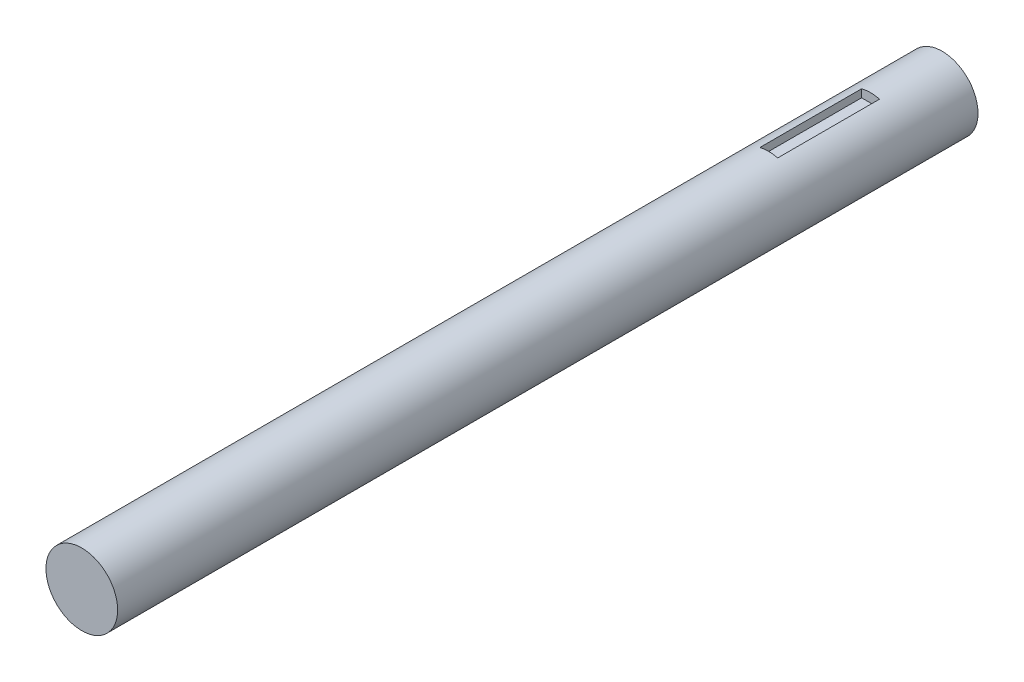
ISO-10303-21;
HEADER;
FILE_DESCRIPTION(('STEP AP214'),'2;1');
FILE_NAME('part.step','',(''),(''),'','','');
FILE_SCHEMA(('AUTOMOTIVE_DESIGN { 1 0 10303 214 1 1 1 1 }'));
ENDSEC;
DATA;
#1=APPLICATION_CONTEXT('core data for automotive mechanical design processes');
#2=APPLICATION_PROTOCOL_DEFINITION('international standard','automotive_design',2000,#1);
#3=PRODUCT_CONTEXT('',#1,'mechanical');
#4=PRODUCT('Part','Part','',(#3));
#5=PRODUCT_RELATED_PRODUCT_CATEGORY('part','',(#4));
#6=PRODUCT_DEFINITION_FORMATION('','',#4);
#7=PRODUCT_DEFINITION_CONTEXT('part definition',#1,'design');
#8=PRODUCT_DEFINITION('design','',#6,#7);
#9=PRODUCT_DEFINITION_SHAPE('','',#8);
#10=(LENGTH_UNIT() NAMED_UNIT(*) SI_UNIT(.MILLI.,.METRE.));
#11=(NAMED_UNIT(*) PLANE_ANGLE_UNIT() SI_UNIT($,.RADIAN.));
#12=(NAMED_UNIT(*) SI_UNIT($,.STERADIAN.) SOLID_ANGLE_UNIT());
#13=UNCERTAINTY_MEASURE_WITH_UNIT(LENGTH_MEASURE(1.E-05),#10,'distance_accuracy_value','');
#14=(GEOMETRIC_REPRESENTATION_CONTEXT(3) GLOBAL_UNCERTAINTY_ASSIGNED_CONTEXT((#13)) GLOBAL_UNIT_ASSIGNED_CONTEXT((#10,
#11,#12)) REPRESENTATION_CONTEXT('',''));
#15=CARTESIAN_POINT('',(0.,0.,0.));
#16=DIRECTION('',(0.,0.,1.));
#17=DIRECTION('',(1.,0.,0.));
#18=AXIS2_PLACEMENT_3D('',#15,#16,#17);
#19=CARTESIAN_POINT('',(0.,0.,152.4));
#20=DIRECTION('',(0.,0.,-1.));
#21=DIRECTION('',(-1.,0.,0.));
#22=AXIS2_PLACEMENT_3D('',#19,#20,#21);
#23=CYLINDRICAL_SURFACE('',#22,6.35);
#24=CARTESIAN_POINT('',(0.,0.,0.));
#25=DIRECTION('',(0.,0.,1.));
#26=DIRECTION('',(1.,0.,0.));
#27=AXIS2_PLACEMENT_3D('',#24,#25,#26);
#28=CIRCLE('',#27,6.35);
#29=CARTESIAN_POINT('',(6.35,0.,0.));
#30=VERTEX_POINT('',#29);
#31=EDGE_CURVE('E99',#30,#30,#28,.T.);
#32=ORIENTED_EDGE('',*,*,#31,.T.);
#33=EDGE_LOOP('',(#32));
#34=FACE_BOUND('',#33,.T.);
#35=CARTESIAN_POINT('',(0.,0.,152.4));
#36=DIRECTION('',(0.,0.,1.));
#37=DIRECTION('',(1.,0.,0.));
#38=AXIS2_PLACEMENT_3D('',#35,#36,#37);
#39=CIRCLE('',#38,6.35);
#40=CARTESIAN_POINT('',(6.35,0.,152.4));
#41=VERTEX_POINT('',#40);
#42=EDGE_CURVE('E101',#41,#41,#39,.T.);
#43=ORIENTED_EDGE('',*,*,#42,.F.);
#44=EDGE_LOOP('',(#43));
#45=FACE_BOUND('',#44,.T.);
#46=CARTESIAN_POINT('',(0.,0.,30.734));
#47=DIRECTION('',(0.,0.,-1.));
#48=DIRECTION('',(-1.,0.,0.));
#49=AXIS2_PLACEMENT_3D('',#46,#47,#48);
#50=CIRCLE('',#49,6.35);
#51=CARTESIAN_POINT('',(-1.57143332462789,6.15248708298107,30.734));
#52=VERTEX_POINT('',#51);
#53=CARTESIAN_POINT('',(1.60356667537211,6.1441902572785,30.734));
#54=VERTEX_POINT('',#53);
#55=EDGE_CURVE('E11',#52,#54,#50,.T.);
#56=ORIENTED_EDGE('',*,*,#55,.F.);
#57=DIRECTION('',(0.,0.,-1.));
#58=VECTOR('',#57,1.);
#59=CARTESIAN_POINT('',(-1.57143332462789,6.15248708298107,152.4));
#60=LINE('',#59,#58);
#61=CARTESIAN_POINT('',(-1.57143332462789,6.15248708298107,12.7));
#62=VERTEX_POINT('',#61);
#63=EDGE_CURVE('E55',#52,#62,#60,.T.);
#64=ORIENTED_EDGE('',*,*,#63,.T.);
#65=CARTESIAN_POINT('',(0.,0.,12.7));
#66=DIRECTION('',(0.,0.,-1.));
#67=DIRECTION('',(-1.,0.,0.));
#68=AXIS2_PLACEMENT_3D('',#65,#66,#67);
#69=CIRCLE('',#68,6.35);
#70=CARTESIAN_POINT('',(1.60356667537211,6.1441902572785,12.7));
#71=VERTEX_POINT('',#70);
#72=EDGE_CURVE('E104',#62,#71,#69,.T.);
#73=ORIENTED_EDGE('',*,*,#72,.T.);
#74=DIRECTION('',(0.,0.,-1.));
#75=VECTOR('',#74,1.);
#76=CARTESIAN_POINT('',(1.60356667537211,6.1441902572785,152.4));
#77=LINE('',#76,#75);
#78=EDGE_CURVE('E40',#71,#54,#77,.F.);
#79=ORIENTED_EDGE('',*,*,#78,.T.);
#80=EDGE_LOOP('',(#56,#64,#73,#79));
#81=FACE_BOUND('',#80,.T.);
#82=ADVANCED_FACE('F33',(#34,#45,#81),#23,.T.);
#83=CARTESIAN_POINT('',(0.,0.,152.4));
#84=DIRECTION('',(0.,0.,1.));
#85=DIRECTION('',(1.,0.,0.));
#86=AXIS2_PLACEMENT_3D('',#83,#84,#85);
#87=PLANE('',#86);
#88=ORIENTED_EDGE('',*,*,#42,.T.);
#89=EDGE_LOOP('',(#88));
#90=FACE_BOUND('',#89,.T.);
#91=ADVANCED_FACE('F124',(#90),#87,.T.);
#92=CARTESIAN_POINT('',(0.,0.,0.));
#93=DIRECTION('',(0.,0.,1.));
#94=DIRECTION('',(1.,0.,0.));
#95=AXIS2_PLACEMENT_3D('',#92,#93,#94);
#96=PLANE('',#95);
#97=ORIENTED_EDGE('',*,*,#31,.F.);
#98=EDGE_LOOP('',(#97));
#99=FACE_BOUND('',#98,.T.);
#100=ADVANCED_FACE('F129',(#99),#96,.F.);
#101=CARTESIAN_POINT('',(1.60356667537211,7.9375,30.734));
#102=DIRECTION('',(1.,0.,0.));
#103=DIRECTION('',(0.,1.,0.));
#104=AXIS2_PLACEMENT_3D('',#101,#102,#103);
#105=PLANE('',#104);
#106=DIRECTION('',(0.,-1.,0.));
#107=VECTOR('',#106,1.);
#108=CARTESIAN_POINT('',(1.60356667537211,7.9375,12.7));
#109=LINE('',#108,#107);
#110=CARTESIAN_POINT('',(1.60356667537211,4.7625,12.7));
#111=VERTEX_POINT('',#110);
#112=EDGE_CURVE('E47',#71,#111,#109,.T.);
#113=ORIENTED_EDGE('',*,*,#112,.T.);
#114=DIRECTION('',(0.,0.,-1.));
#115=VECTOR('',#114,1.);
#116=CARTESIAN_POINT('',(1.60356667537211,4.7625,30.734));
#117=LINE('',#116,#115);
#118=CARTESIAN_POINT('',(1.60356667537211,4.7625,30.734));
#119=VERTEX_POINT('',#118);
#120=EDGE_CURVE('E89',#119,#111,#117,.T.);
#121=ORIENTED_EDGE('',*,*,#120,.F.);
#122=DIRECTION('',(0.,-1.,0.));
#123=VECTOR('',#122,1.);
#124=CARTESIAN_POINT('',(1.60356667537211,7.9375,30.734));
#125=LINE('',#124,#123);
#126=EDGE_CURVE('E79',#54,#119,#125,.T.);
#127=ORIENTED_EDGE('',*,*,#126,.F.);
#128=ORIENTED_EDGE('',*,*,#78,.F.);
#129=EDGE_LOOP('',(#113,#121,#127,#128));
#130=FACE_BOUND('',#129,.T.);
#131=ADVANCED_FACE('F112',(#130),#105,.F.);
#132=CARTESIAN_POINT('',(-1.57143332462789,4.7625,30.734));
#133=DIRECTION('',(-1.,0.,0.));
#134=DIRECTION('',(0.,0.,1.));
#135=AXIS2_PLACEMENT_3D('',#132,#133,#134);
#136=PLANE('',#135);
#137=DIRECTION('',(0.,1.,0.));
#138=VECTOR('',#137,1.);
#139=CARTESIAN_POINT('',(-1.57143332462789,4.7625,30.734));
#140=LINE('',#139,#138);
#141=CARTESIAN_POINT('',(-1.57143332462789,4.7625,30.734));
#142=VERTEX_POINT('',#141);
#143=EDGE_CURVE('E76',#142,#52,#140,.T.);
#144=ORIENTED_EDGE('',*,*,#143,.F.);
#145=DIRECTION('',(0.,0.,-1.));
#146=VECTOR('',#145,1.);
#147=CARTESIAN_POINT('',(-1.57143332462789,4.7625,30.734));
#148=LINE('',#147,#146);
#149=CARTESIAN_POINT('',(-1.57143332462789,4.7625,12.7));
#150=VERTEX_POINT('',#149);
#151=EDGE_CURVE('E85',#142,#150,#148,.T.);
#152=ORIENTED_EDGE('',*,*,#151,.T.);
#153=DIRECTION('',(0.,1.,0.));
#154=VECTOR('',#153,1.);
#155=CARTESIAN_POINT('',(-1.57143332462789,4.7625,12.7));
#156=LINE('',#155,#154);
#157=EDGE_CURVE('E96',#150,#62,#156,.T.);
#158=ORIENTED_EDGE('',*,*,#157,.T.);
#159=ORIENTED_EDGE('',*,*,#63,.F.);
#160=EDGE_LOOP('',(#144,#152,#158,#159));
#161=FACE_BOUND('',#160,.T.);
#162=ADVANCED_FACE('F91',(#161),#136,.F.);
#163=CARTESIAN_POINT('',(0.,0.,30.734));
#164=DIRECTION('',(0.,0.,-1.));
#165=DIRECTION('',(-1.,0.,0.));
#166=AXIS2_PLACEMENT_3D('',#163,#164,#165);
#167=PLANE('',#166);
#168=ORIENTED_EDGE('',*,*,#55,.T.);
#169=ORIENTED_EDGE('',*,*,#126,.T.);
#170=DIRECTION('',(-1.,0.,0.));
#171=VECTOR('',#170,1.);
#172=CARTESIAN_POINT('',(0.0160666753721095,4.7625,30.734));
#173=LINE('',#172,#171);
#174=EDGE_CURVE('E73',#119,#142,#173,.T.);
#175=ORIENTED_EDGE('',*,*,#174,.T.);
#176=ORIENTED_EDGE('',*,*,#143,.T.);
#177=EDGE_LOOP('',(#168,#169,#175,#176));
#178=FACE_BOUND('',#177,.T.);
#179=ADVANCED_FACE('F75',(#178),#167,.T.);
#180=CARTESIAN_POINT('',(0.,0.,12.7));
#181=DIRECTION('',(0.,0.,-1.));
#182=DIRECTION('',(-1.,0.,0.));
#183=AXIS2_PLACEMENT_3D('',#180,#181,#182);
#184=PLANE('',#183);
#185=ORIENTED_EDGE('',*,*,#157,.F.);
#186=DIRECTION('',(-1.,0.,0.));
#187=VECTOR('',#186,1.);
#188=CARTESIAN_POINT('',(-1.57143332462789,4.7625,12.7));
#189=LINE('',#188,#187);
#190=EDGE_CURVE('E87',#111,#150,#189,.T.);
#191=ORIENTED_EDGE('',*,*,#190,.F.);
#192=ORIENTED_EDGE('',*,*,#112,.F.);
#193=ORIENTED_EDGE('',*,*,#72,.F.);
#194=EDGE_LOOP('',(#185,#191,#192,#193));
#195=FACE_BOUND('',#194,.T.);
#196=ADVANCED_FACE('F113',(#195),#184,.F.);
#197=CARTESIAN_POINT('',(-1.57143332462789,4.7625,30.734));
#198=DIRECTION('',(0.,-1.,0.));
#199=DIRECTION('',(1.,0.,0.));
#200=AXIS2_PLACEMENT_3D('',#197,#198,#199);
#201=PLANE('',#200);
#202=ORIENTED_EDGE('',*,*,#190,.T.);
#203=ORIENTED_EDGE('',*,*,#151,.F.);
#204=ORIENTED_EDGE('',*,*,#174,.F.);
#205=ORIENTED_EDGE('',*,*,#120,.T.);
#206=EDGE_LOOP('',(#202,#203,#204,#205));
#207=FACE_BOUND('',#206,.T.);
#208=ADVANCED_FACE('F86',(#207),#201,.F.);
#209=CLOSED_SHELL('',(#82,#91,#100,#131,#162,#179,#196,#208));
#210=MANIFOLD_SOLID_BREP('B2',#209);
#211=ADVANCED_BREP_SHAPE_REPRESENTATION('',(#18,#210),#14);
#212=SHAPE_DEFINITION_REPRESENTATION(#9,#211);
ENDSEC;
END-ISO-10303-21;
